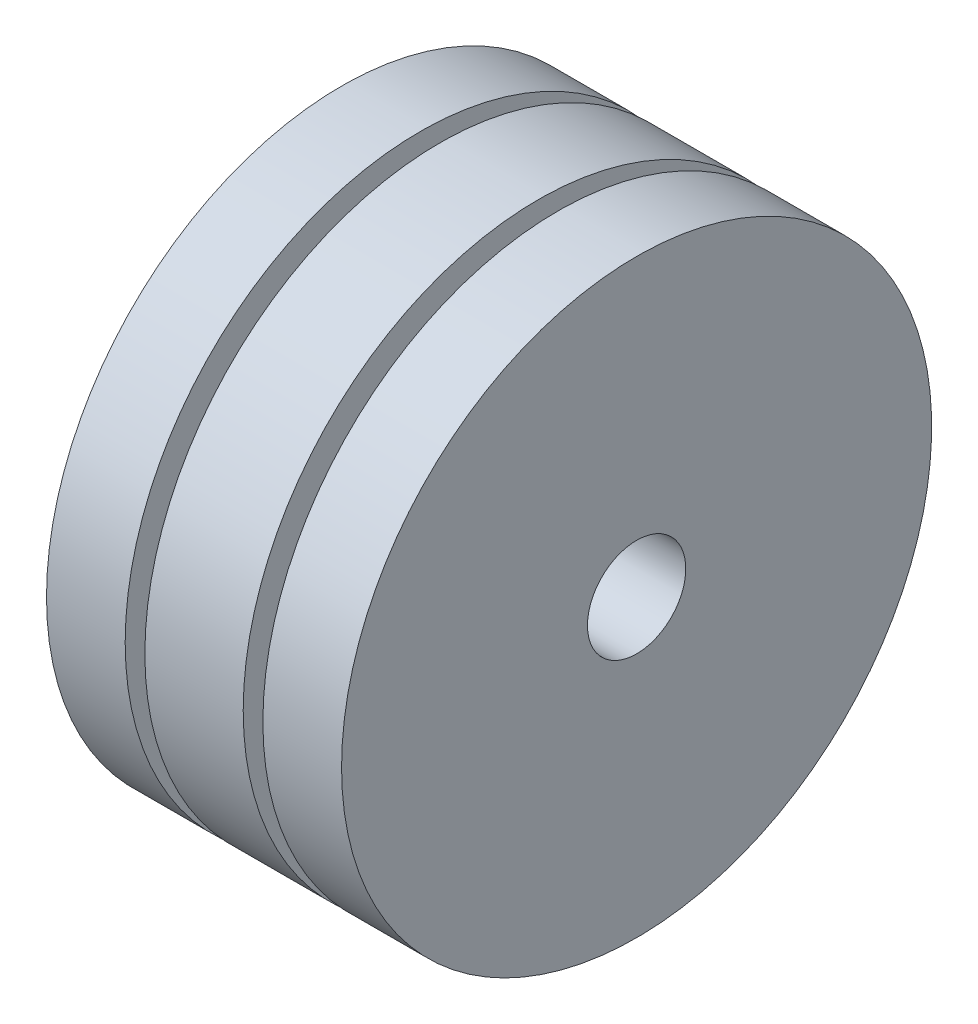
ISO-10303-21;
HEADER;
FILE_DESCRIPTION(('STEP AP214'),'2;1');
FILE_NAME('part.step','',(''),(''),'','','');
FILE_SCHEMA(('AUTOMOTIVE_DESIGN { 1 0 10303 214 1 1 1 1 }'));
ENDSEC;
DATA;
#1=APPLICATION_CONTEXT('core data for automotive mechanical design processes');
#2=APPLICATION_PROTOCOL_DEFINITION('international standard','automotive_design',2000,#1);
#3=PRODUCT_CONTEXT('',#1,'mechanical');
#4=PRODUCT('Part','Part','',(#3));
#5=PRODUCT_RELATED_PRODUCT_CATEGORY('part','',(#4));
#6=PRODUCT_DEFINITION_FORMATION('','',#4);
#7=PRODUCT_DEFINITION_CONTEXT('part definition',#1,'design');
#8=PRODUCT_DEFINITION('design','',#6,#7);
#9=PRODUCT_DEFINITION_SHAPE('','',#8);
#10=(LENGTH_UNIT() NAMED_UNIT(*) SI_UNIT(.MILLI.,.METRE.));
#11=(NAMED_UNIT(*) PLANE_ANGLE_UNIT() SI_UNIT($,.RADIAN.));
#12=(NAMED_UNIT(*) SI_UNIT($,.STERADIAN.) SOLID_ANGLE_UNIT());
#13=UNCERTAINTY_MEASURE_WITH_UNIT(LENGTH_MEASURE(1.E-05),#10,'distance_accuracy_value','');
#14=(GEOMETRIC_REPRESENTATION_CONTEXT(3) GLOBAL_UNCERTAINTY_ASSIGNED_CONTEXT((#13)) GLOBAL_UNIT_ASSIGNED_CONTEXT((#10,
#11,#12)) REPRESENTATION_CONTEXT('',''));
#15=CARTESIAN_POINT('',(0.,0.,0.));
#16=DIRECTION('',(0.,0.,1.));
#17=DIRECTION('',(1.,0.,0.));
#18=AXIS2_PLACEMENT_3D('',#15,#16,#17);
#19=CARTESIAN_POINT('',(-32.4645036974758,0.,-17.5));
#20=DIRECTION('',(-1.,0.,0.));
#21=DIRECTION('',(0.,0.,1.));
#22=AXIS2_PLACEMENT_3D('',#19,#20,#21);
#23=CYLINDRICAL_SURFACE('',#22,30.);
#24=CARTESIAN_POINT('',(15.,0.,-17.5));
#25=DIRECTION('',(-1.,0.,0.));
#26=DIRECTION('',(0.,0.,1.));
#27=AXIS2_PLACEMENT_3D('',#24,#25,#26);
#28=CIRCLE('',#27,30.);
#29=CARTESIAN_POINT('',(15.,0.,12.5));
#30=VERTEX_POINT('',#29);
#31=EDGE_CURVE('E71',#30,#30,#28,.T.);
#32=ORIENTED_EDGE('',*,*,#31,.T.);
#33=EDGE_LOOP('',(#32));
#34=FACE_BOUND('',#33,.T.);
#35=CARTESIAN_POINT('',(7.,0.,-17.5));
#36=DIRECTION('',(-1.,0.,0.));
#37=DIRECTION('',(0.,0.,1.));
#38=AXIS2_PLACEMENT_3D('',#35,#36,#37);
#39=CIRCLE('',#38,30.);
#40=CARTESIAN_POINT('',(7.,0.,12.5));
#41=VERTEX_POINT('',#40);
#42=EDGE_CURVE('E10',#41,#41,#39,.T.);
#43=ORIENTED_EDGE('',*,*,#42,.F.);
#44=EDGE_LOOP('',(#43));
#45=FACE_BOUND('',#44,.T.);
#46=ADVANCED_FACE('F31',(#34,#45),#23,.T.);
#47=CARTESIAN_POINT('',(7.,0.,12.5));
#48=DIRECTION('',(-1.,0.,0.));
#49=DIRECTION('',(0.,0.,1.));
#50=AXIS2_PLACEMENT_3D('',#47,#48,#49);
#51=PLANE('',#50);
#52=ORIENTED_EDGE('',*,*,#42,.T.);
#53=EDGE_LOOP('',(#52));
#54=FACE_BOUND('',#53,.T.);
#55=CARTESIAN_POINT('',(7.,0.,-17.5));
#56=DIRECTION('',(-1.,0.,0.));
#57=DIRECTION('',(0.,0.,1.));
#58=AXIS2_PLACEMENT_3D('',#55,#56,#57);
#59=CIRCLE('',#58,10.);
#60=CARTESIAN_POINT('',(7.,0.,-7.5));
#61=VERTEX_POINT('',#60);
#62=EDGE_CURVE('E37',#61,#61,#59,.T.);
#63=ORIENTED_EDGE('',*,*,#62,.F.);
#64=EDGE_LOOP('',(#63));
#65=FACE_BOUND('',#64,.T.);
#66=ADVANCED_FACE('F89',(#54,#65),#51,.T.);
#67=CARTESIAN_POINT('',(-32.4645036974758,0.,-17.5));
#68=DIRECTION('',(-1.,0.,0.));
#69=DIRECTION('',(0.,0.,1.));
#70=AXIS2_PLACEMENT_3D('',#67,#68,#69);
#71=CYLINDRICAL_SURFACE('',#70,10.);
#72=ORIENTED_EDGE('',*,*,#62,.T.);
#73=EDGE_LOOP('',(#72));
#74=FACE_BOUND('',#73,.T.);
#75=CARTESIAN_POINT('',(5.,0.,-17.5));
#76=DIRECTION('',(-1.,0.,0.));
#77=DIRECTION('',(0.,0.,1.));
#78=AXIS2_PLACEMENT_3D('',#75,#76,#77);
#79=CIRCLE('',#78,10.);
#80=CARTESIAN_POINT('',(5.,0.,-7.5));
#81=VERTEX_POINT('',#80);
#82=EDGE_CURVE('E41',#81,#81,#79,.T.);
#83=ORIENTED_EDGE('',*,*,#82,.F.);
#84=EDGE_LOOP('',(#83));
#85=FACE_BOUND('',#84,.T.);
#86=ADVANCED_FACE('F93',(#74,#85),#71,.T.);
#87=CARTESIAN_POINT('',(5.,0.,12.5));
#88=DIRECTION('',(1.,0.,0.));
#89=DIRECTION('',(0.,0.,-1.));
#90=AXIS2_PLACEMENT_3D('',#87,#88,#89);
#91=PLANE('',#90);
#92=ORIENTED_EDGE('',*,*,#82,.T.);
#93=EDGE_LOOP('',(#92));
#94=FACE_BOUND('',#93,.T.);
#95=CARTESIAN_POINT('',(5.,0.,-17.5));
#96=DIRECTION('',(-1.,0.,0.));
#97=DIRECTION('',(0.,0.,1.));
#98=AXIS2_PLACEMENT_3D('',#95,#96,#97);
#99=CIRCLE('',#98,30.);
#100=CARTESIAN_POINT('',(5.,0.,12.5));
#101=VERTEX_POINT('',#100);
#102=EDGE_CURVE('E45',#101,#101,#99,.T.);
#103=ORIENTED_EDGE('',*,*,#102,.F.);
#104=EDGE_LOOP('',(#103));
#105=FACE_BOUND('',#104,.T.);
#106=ADVANCED_FACE('F97',(#94,#105),#91,.T.);
#107=CARTESIAN_POINT('',(-32.4645036974758,0.,-17.5));
#108=DIRECTION('',(-1.,0.,0.));
#109=DIRECTION('',(0.,0.,1.));
#110=AXIS2_PLACEMENT_3D('',#107,#108,#109);
#111=CYLINDRICAL_SURFACE('',#110,30.);
#112=ORIENTED_EDGE('',*,*,#102,.T.);
#113=EDGE_LOOP('',(#112));
#114=FACE_BOUND('',#113,.T.);
#115=CARTESIAN_POINT('',(-5.,0.,-17.5));
#116=DIRECTION('',(-1.,0.,0.));
#117=DIRECTION('',(0.,0.,1.));
#118=AXIS2_PLACEMENT_3D('',#115,#116,#117);
#119=CIRCLE('',#118,30.);
#120=CARTESIAN_POINT('',(-5.,0.,12.5));
#121=VERTEX_POINT('',#120);
#122=EDGE_CURVE('E50',#121,#121,#119,.T.);
#123=ORIENTED_EDGE('',*,*,#122,.F.);
#124=EDGE_LOOP('',(#123));
#125=FACE_BOUND('',#124,.T.);
#126=ADVANCED_FACE('F103',(#114,#125),#111,.T.);
#127=CARTESIAN_POINT('',(-5.,0.,12.5));
#128=DIRECTION('',(-1.,0.,0.));
#129=DIRECTION('',(0.,0.,1.));
#130=AXIS2_PLACEMENT_3D('',#127,#128,#129);
#131=PLANE('',#130);
#132=ORIENTED_EDGE('',*,*,#122,.T.);
#133=EDGE_LOOP('',(#132));
#134=FACE_BOUND('',#133,.T.);
#135=CARTESIAN_POINT('',(-5.,0.,-17.5));
#136=DIRECTION('',(-1.,0.,0.));
#137=DIRECTION('',(0.,0.,1.));
#138=AXIS2_PLACEMENT_3D('',#135,#136,#137);
#139=CIRCLE('',#138,10.);
#140=CARTESIAN_POINT('',(-5.,0.,-7.5));
#141=VERTEX_POINT('',#140);
#142=EDGE_CURVE('E53',#141,#141,#139,.T.);
#143=ORIENTED_EDGE('',*,*,#142,.F.);
#144=EDGE_LOOP('',(#143));
#145=FACE_BOUND('',#144,.T.);
#146=ADVANCED_FACE('F107',(#134,#145),#131,.T.);
#147=CARTESIAN_POINT('',(-32.4645036974758,0.,-17.5));
#148=DIRECTION('',(-1.,0.,0.));
#149=DIRECTION('',(0.,0.,1.));
#150=AXIS2_PLACEMENT_3D('',#147,#148,#149);
#151=CYLINDRICAL_SURFACE('',#150,10.);
#152=ORIENTED_EDGE('',*,*,#142,.T.);
#153=EDGE_LOOP('',(#152));
#154=FACE_BOUND('',#153,.T.);
#155=CARTESIAN_POINT('',(-7.,0.,-17.5));
#156=DIRECTION('',(-1.,0.,0.));
#157=DIRECTION('',(0.,0.,1.));
#158=AXIS2_PLACEMENT_3D('',#155,#156,#157);
#159=CIRCLE('',#158,10.);
#160=CARTESIAN_POINT('',(-7.,0.,-7.5));
#161=VERTEX_POINT('',#160);
#162=EDGE_CURVE('E56',#161,#161,#159,.T.);
#163=ORIENTED_EDGE('',*,*,#162,.F.);
#164=EDGE_LOOP('',(#163));
#165=FACE_BOUND('',#164,.T.);
#166=ADVANCED_FACE('F111',(#154,#165),#151,.T.);
#167=CARTESIAN_POINT('',(-7.,0.,12.5));
#168=DIRECTION('',(1.,0.,0.));
#169=DIRECTION('',(0.,0.,-1.));
#170=AXIS2_PLACEMENT_3D('',#167,#168,#169);
#171=PLANE('',#170);
#172=ORIENTED_EDGE('',*,*,#162,.T.);
#173=EDGE_LOOP('',(#172));
#174=FACE_BOUND('',#173,.T.);
#175=CARTESIAN_POINT('',(-7.,0.,-17.5));
#176=DIRECTION('',(-1.,0.,0.));
#177=DIRECTION('',(0.,0.,1.));
#178=AXIS2_PLACEMENT_3D('',#175,#176,#177);
#179=CIRCLE('',#178,30.);
#180=CARTESIAN_POINT('',(-7.,0.,12.5));
#181=VERTEX_POINT('',#180);
#182=EDGE_CURVE('E59',#181,#181,#179,.T.);
#183=ORIENTED_EDGE('',*,*,#182,.F.);
#184=EDGE_LOOP('',(#183));
#185=FACE_BOUND('',#184,.T.);
#186=ADVANCED_FACE('F115',(#174,#185),#171,.T.);
#187=CARTESIAN_POINT('',(-32.4645036974758,0.,-17.5));
#188=DIRECTION('',(-1.,0.,0.));
#189=DIRECTION('',(0.,0.,1.));
#190=AXIS2_PLACEMENT_3D('',#187,#188,#189);
#191=CYLINDRICAL_SURFACE('',#190,30.);
#192=ORIENTED_EDGE('',*,*,#182,.T.);
#193=EDGE_LOOP('',(#192));
#194=FACE_BOUND('',#193,.T.);
#195=CARTESIAN_POINT('',(-15.,0.,-17.5));
#196=DIRECTION('',(-1.,0.,0.));
#197=DIRECTION('',(0.,0.,1.));
#198=AXIS2_PLACEMENT_3D('',#195,#196,#197);
#199=CIRCLE('',#198,30.);
#200=CARTESIAN_POINT('',(-15.,0.,12.5));
#201=VERTEX_POINT('',#200);
#202=EDGE_CURVE('E62',#201,#201,#199,.T.);
#203=ORIENTED_EDGE('',*,*,#202,.F.);
#204=EDGE_LOOP('',(#203));
#205=FACE_BOUND('',#204,.T.);
#206=ADVANCED_FACE('F119',(#194,#205),#191,.T.);
#207=CARTESIAN_POINT('',(-15.,0.,-12.5));
#208=DIRECTION('',(-1.,0.,0.));
#209=DIRECTION('',(0.,0.,1.));
#210=AXIS2_PLACEMENT_3D('',#207,#208,#209);
#211=PLANE('',#210);
#212=ORIENTED_EDGE('',*,*,#202,.T.);
#213=EDGE_LOOP('',(#212));
#214=FACE_BOUND('',#213,.T.);
#215=CARTESIAN_POINT('',(-15.,0.,-17.5));
#216=DIRECTION('',(-1.,0.,0.));
#217=DIRECTION('',(0.,0.,1.));
#218=AXIS2_PLACEMENT_3D('',#215,#216,#217);
#219=CIRCLE('',#218,5.);
#220=CARTESIAN_POINT('',(-15.,0.,-12.5));
#221=VERTEX_POINT('',#220);
#222=EDGE_CURVE('E65',#221,#221,#219,.T.);
#223=ORIENTED_EDGE('',*,*,#222,.F.);
#224=EDGE_LOOP('',(#223));
#225=FACE_BOUND('',#224,.T.);
#226=ADVANCED_FACE('F85',(#214,#225),#211,.T.);
#227=CARTESIAN_POINT('',(-32.4645036974758,0.,-17.5));
#228=DIRECTION('',(-1.,0.,0.));
#229=DIRECTION('',(0.,0.,1.));
#230=AXIS2_PLACEMENT_3D('',#227,#228,#229);
#231=CYLINDRICAL_SURFACE('',#230,5.);
#232=ORIENTED_EDGE('',*,*,#222,.T.);
#233=EDGE_LOOP('',(#232));
#234=FACE_BOUND('',#233,.T.);
#235=CARTESIAN_POINT('',(15.,0.,-17.5));
#236=DIRECTION('',(-1.,0.,0.));
#237=DIRECTION('',(0.,0.,1.));
#238=AXIS2_PLACEMENT_3D('',#235,#236,#237);
#239=CIRCLE('',#238,5.);
#240=CARTESIAN_POINT('',(15.,0.,-12.5));
#241=VERTEX_POINT('',#240);
#242=EDGE_CURVE('E68',#241,#241,#239,.T.);
#243=ORIENTED_EDGE('',*,*,#242,.F.);
#244=EDGE_LOOP('',(#243));
#245=FACE_BOUND('',#244,.T.);
#246=ADVANCED_FACE('F79',(#234,#245),#231,.F.);
#247=CARTESIAN_POINT('',(15.,0.,-12.5));
#248=DIRECTION('',(1.,0.,0.));
#249=DIRECTION('',(0.,0.,-1.));
#250=AXIS2_PLACEMENT_3D('',#247,#248,#249);
#251=PLANE('',#250);
#252=ORIENTED_EDGE('',*,*,#242,.T.);
#253=EDGE_LOOP('',(#252));
#254=FACE_BOUND('',#253,.T.);
#255=ORIENTED_EDGE('',*,*,#31,.F.);
#256=EDGE_LOOP('',(#255));
#257=FACE_BOUND('',#256,.T.);
#258=ADVANCED_FACE('F77',(#254,#257),#251,.T.);
#259=CLOSED_SHELL('',(#46,#66,#86,#106,#126,#146,#166,#186,#206,#226,#246,#258));
#260=MANIFOLD_SOLID_BREP('B2',#259);
#261=ADVANCED_BREP_SHAPE_REPRESENTATION('',(#18,#260),#14);
#262=SHAPE_DEFINITION_REPRESENTATION(#9,#261);
ENDSEC;
END-ISO-10303-21;
